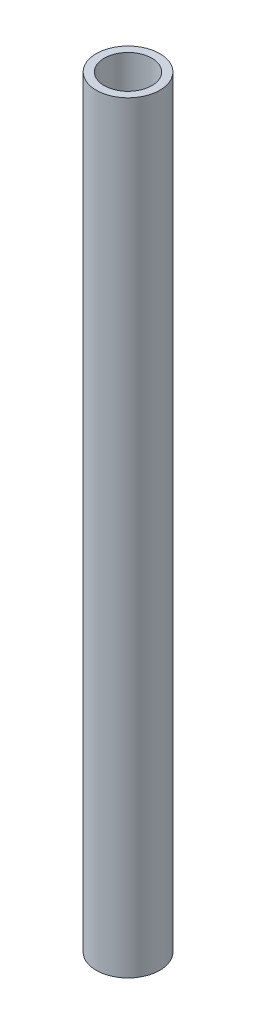
ISO-10303-21;
HEADER;
FILE_DESCRIPTION(('STEP AP214'),'2;1');
FILE_NAME('part.step','',(''),(''),'','','');
FILE_SCHEMA(('AUTOMOTIVE_DESIGN { 1 0 10303 214 1 1 1 1 }'));
ENDSEC;
DATA;
#1=APPLICATION_CONTEXT('core data for automotive mechanical design processes');
#2=APPLICATION_PROTOCOL_DEFINITION('international standard','automotive_design',2000,#1);
#3=PRODUCT_CONTEXT('',#1,'mechanical');
#4=PRODUCT('Part','Part','',(#3));
#5=PRODUCT_RELATED_PRODUCT_CATEGORY('part','',(#4));
#6=PRODUCT_DEFINITION_FORMATION('','',#4);
#7=PRODUCT_DEFINITION_CONTEXT('part definition',#1,'design');
#8=PRODUCT_DEFINITION('design','',#6,#7);
#9=PRODUCT_DEFINITION_SHAPE('','',#8);
#10=(LENGTH_UNIT() NAMED_UNIT(*) SI_UNIT(.MILLI.,.METRE.));
#11=(NAMED_UNIT(*) PLANE_ANGLE_UNIT() SI_UNIT($,.RADIAN.));
#12=(NAMED_UNIT(*) SI_UNIT($,.STERADIAN.) SOLID_ANGLE_UNIT());
#13=UNCERTAINTY_MEASURE_WITH_UNIT(LENGTH_MEASURE(1.E-05),#10,'distance_accuracy_value','');
#14=(GEOMETRIC_REPRESENTATION_CONTEXT(3) GLOBAL_UNCERTAINTY_ASSIGNED_CONTEXT((#13)) GLOBAL_UNIT_ASSIGNED_CONTEXT((#10,
#11,#12)) REPRESENTATION_CONTEXT('',''));
#15=CARTESIAN_POINT('',(0.,0.,0.));
#16=DIRECTION('',(0.,0.,1.));
#17=DIRECTION('',(1.,0.,0.));
#18=AXIS2_PLACEMENT_3D('',#15,#16,#17);
#19=CARTESIAN_POINT('',(0.,609.6,0.));
#20=DIRECTION('',(0.,1.,0.));
#21=DIRECTION('',(0.,0.,1.));
#22=AXIS2_PLACEMENT_3D('',#19,#20,#21);
#23=PLANE('',#22);
#24=CARTESIAN_POINT('',(0.,609.6,0.));
#25=DIRECTION('',(0.,1.,0.));
#26=DIRECTION('',(0.,0.,1.));
#27=AXIS2_PLACEMENT_3D('',#24,#25,#26);
#28=CIRCLE('',#27,25.4);
#29=CARTESIAN_POINT('',(0.,609.6,-25.4));
#30=VERTEX_POINT('',#29);
#31=EDGE_CURVE('E10',#30,#30,#28,.T.);
#32=ORIENTED_EDGE('',*,*,#31,.T.);
#33=EDGE_LOOP('',(#32));
#34=FACE_BOUND('',#33,.T.);
#35=CARTESIAN_POINT('',(0.,609.6,0.));
#36=DIRECTION('',(0.,1.,0.));
#37=DIRECTION('',(0.,0.,1.));
#38=AXIS2_PLACEMENT_3D('',#35,#36,#37);
#39=CIRCLE('',#38,19.05);
#40=CARTESIAN_POINT('',(0.,609.6,-19.05));
#41=VERTEX_POINT('',#40);
#42=EDGE_CURVE('E50',#41,#41,#39,.T.);
#43=ORIENTED_EDGE('',*,*,#42,.F.);
#44=EDGE_LOOP('',(#43));
#45=FACE_BOUND('',#44,.T.);
#46=ADVANCED_FACE('F37',(#34,#45),#23,.T.);
#47=CARTESIAN_POINT('',(0.,0.,0.));
#48=DIRECTION('',(0.,1.,0.));
#49=DIRECTION('',(0.,0.,1.));
#50=AXIS2_PLACEMENT_3D('',#47,#48,#49);
#51=PLANE('',#50);
#52=CARTESIAN_POINT('',(0.,0.,0.));
#53=DIRECTION('',(0.,1.,0.));
#54=DIRECTION('',(0.,0.,1.));
#55=AXIS2_PLACEMENT_3D('',#52,#53,#54);
#56=CIRCLE('',#55,25.4);
#57=CARTESIAN_POINT('',(0.,0.,-25.4));
#58=VERTEX_POINT('',#57);
#59=EDGE_CURVE('E41',#58,#58,#56,.T.);
#60=ORIENTED_EDGE('',*,*,#59,.F.);
#61=EDGE_LOOP('',(#60));
#62=FACE_BOUND('',#61,.T.);
#63=CARTESIAN_POINT('',(0.,0.,0.));
#64=DIRECTION('',(0.,1.,0.));
#65=DIRECTION('',(0.,0.,1.));
#66=AXIS2_PLACEMENT_3D('',#63,#64,#65);
#67=CIRCLE('',#66,19.05);
#68=CARTESIAN_POINT('',(0.,0.,-19.05));
#69=VERTEX_POINT('',#68);
#70=EDGE_CURVE('E52',#69,#69,#67,.T.);
#71=ORIENTED_EDGE('',*,*,#70,.T.);
#72=EDGE_LOOP('',(#71));
#73=FACE_BOUND('',#72,.T.);
#74=ADVANCED_FACE('F64',(#62,#73),#51,.F.);
#75=CARTESIAN_POINT('',(0.,609.6,0.));
#76=DIRECTION('',(0.,-1.,0.));
#77=DIRECTION('',(0.,0.,-1.));
#78=AXIS2_PLACEMENT_3D('',#75,#76,#77);
#79=CYLINDRICAL_SURFACE('',#78,25.4);
#80=CARTESIAN_POINT('',(0.,609.6,-25.4));
#81=CARTESIAN_POINT('',(0.,603.25,-25.4));
#82=CARTESIAN_POINT('',(0.,596.9,-25.4));
#83=CARTESIAN_POINT('',(0.,584.2,-25.4));
#84=CARTESIAN_POINT('',(0.,577.85,-25.4));
#85=CARTESIAN_POINT('',(0.,565.15,-25.4));
#86=CARTESIAN_POINT('',(0.,558.8,-25.4));
#87=CARTESIAN_POINT('',(0.,546.1,-25.4));
#88=CARTESIAN_POINT('',(0.,539.75,-25.4));
#89=CARTESIAN_POINT('',(0.,527.05,-25.4));
#90=CARTESIAN_POINT('',(0.,520.7,-25.4));
#91=CARTESIAN_POINT('',(0.,508.,-25.4));
#92=CARTESIAN_POINT('',(0.,501.65,-25.4));
#93=CARTESIAN_POINT('',(0.,488.95,-25.4));
#94=CARTESIAN_POINT('',(0.,482.6,-25.4));
#95=CARTESIAN_POINT('',(0.,469.9,-25.4));
#96=CARTESIAN_POINT('',(0.,463.55,-25.4));
#97=CARTESIAN_POINT('',(0.,450.85,-25.4));
#98=CARTESIAN_POINT('',(0.,444.5,-25.4));
#99=CARTESIAN_POINT('',(0.,431.8,-25.4));
#100=CARTESIAN_POINT('',(0.,425.45,-25.4));
#101=CARTESIAN_POINT('',(0.,412.75,-25.4));
#102=CARTESIAN_POINT('',(0.,406.4,-25.4));
#103=CARTESIAN_POINT('',(0.,393.7,-25.4));
#104=CARTESIAN_POINT('',(0.,387.35,-25.4));
#105=CARTESIAN_POINT('',(0.,374.65,-25.4));
#106=CARTESIAN_POINT('',(0.,368.3,-25.4));
#107=CARTESIAN_POINT('',(0.,355.6,-25.4));
#108=CARTESIAN_POINT('',(0.,349.25,-25.4));
#109=CARTESIAN_POINT('',(0.,336.55,-25.4));
#110=CARTESIAN_POINT('',(0.,330.2,-25.4));
#111=CARTESIAN_POINT('',(0.,317.5,-25.4));
#112=CARTESIAN_POINT('',(0.,311.15,-25.4));
#113=CARTESIAN_POINT('',(0.,298.45,-25.4));
#114=CARTESIAN_POINT('',(0.,292.1,-25.4));
#115=CARTESIAN_POINT('',(0.,279.4,-25.4));
#116=CARTESIAN_POINT('',(0.,273.05,-25.4));
#117=CARTESIAN_POINT('',(0.,260.35,-25.4));
#118=CARTESIAN_POINT('',(0.,254.,-25.4));
#119=CARTESIAN_POINT('',(0.,241.3,-25.4));
#120=CARTESIAN_POINT('',(0.,234.95,-25.4));
#121=CARTESIAN_POINT('',(0.,222.25,-25.4));
#122=CARTESIAN_POINT('',(0.,215.9,-25.4));
#123=CARTESIAN_POINT('',(0.,203.2,-25.4));
#124=CARTESIAN_POINT('',(0.,196.85,-25.4));
#125=CARTESIAN_POINT('',(0.,184.15,-25.4));
#126=CARTESIAN_POINT('',(0.,177.8,-25.4));
#127=CARTESIAN_POINT('',(0.,165.1,-25.4));
#128=CARTESIAN_POINT('',(0.,158.75,-25.4));
#129=CARTESIAN_POINT('',(0.,146.05,-25.4));
#130=CARTESIAN_POINT('',(0.,139.7,-25.4));
#131=CARTESIAN_POINT('',(0.,127.,-25.4));
#132=CARTESIAN_POINT('',(0.,120.65,-25.4));
#133=CARTESIAN_POINT('',(0.,107.95,-25.4));
#134=CARTESIAN_POINT('',(0.,101.6,-25.4));
#135=CARTESIAN_POINT('',(0.,88.9,-25.4));
#136=CARTESIAN_POINT('',(0.,82.5500000000001,-25.4));
#137=CARTESIAN_POINT('',(0.,69.85,-25.4));
#138=CARTESIAN_POINT('',(0.,63.5,-25.4));
#139=CARTESIAN_POINT('',(0.,50.8,-25.4));
#140=CARTESIAN_POINT('',(0.,44.45,-25.4));
#141=CARTESIAN_POINT('',(0.,31.75,-25.4));
#142=CARTESIAN_POINT('',(0.,25.4,-25.4));
#143=CARTESIAN_POINT('',(0.,12.7,-25.4));
#144=CARTESIAN_POINT('',(0.,6.35000000000001,-25.4));
#145=CARTESIAN_POINT('',(0.,0.,-25.4));
#146=B_SPLINE_CURVE_WITH_KNOTS('',3,(#80,#81,#82,#83,#84,#85,#86,#87,#88,#89,#90,#91,#92,#93,
#94,#95,#96,#97,#98,#99,#100,#101,#102,#103,#104,#105,#106,#107,#108,#109,#110,#111,#112,#113,
#114,#115,#116,#117,#118,#119,#120,#121,#122,#123,#124,#125,#126,#127,#128,#129,#130,#131,#132,
#133,#134,#135,#136,#137,#138,#139,#140,#141,#142,#143,#144,#145),.UNSPECIFIED.,.F.,.F.,(4,2,2,
2,2,2,2,2,2,2,2,2,2,2,2,2,2,2,2,2,2,2,2,2,2,2,2,2,2,2,2,2,4),(0.,19.05,38.1,57.15,76.2,
95.2500000000001,114.3,133.35,152.4,171.45,190.5,209.55,228.6,247.65,266.7,285.75,304.8,323.85,
342.9,361.95,381.,400.05,419.1,438.15,457.2,476.25,495.3,514.35,533.4,552.45,571.5,590.55,
609.6),.UNSPECIFIED.);
#147=EDGE_CURVE('BSEAM39',#30,#58,#146,.T.);
#148=ORIENTED_EDGE('',*,*,#31,.F.);
#149=ORIENTED_EDGE('',*,*,#59,.T.);
#150=ORIENTED_EDGE('',*,*,#147,.T.);
#151=ORIENTED_EDGE('',*,*,#147,.F.);
#152=EDGE_LOOP('',(#148,#150,#149,#151));
#153=FACE_BOUND('',#152,.T.);
#154=ADVANCED_FACE('F39',(#153),#79,.T.);
#155=CARTESIAN_POINT('',(0.,609.6,0.));
#156=DIRECTION('',(0.,-1.,0.));
#157=DIRECTION('',(0.,0.,-1.));
#158=AXIS2_PLACEMENT_3D('',#155,#156,#157);
#159=CYLINDRICAL_SURFACE('',#158,19.05);
#160=CARTESIAN_POINT('',(0.,609.6,-19.05));
#161=CARTESIAN_POINT('',(0.,603.25,-19.05));
#162=CARTESIAN_POINT('',(0.,596.9,-19.05));
#163=CARTESIAN_POINT('',(0.,584.2,-19.05));
#164=CARTESIAN_POINT('',(0.,577.85,-19.05));
#165=CARTESIAN_POINT('',(0.,565.15,-19.05));
#166=CARTESIAN_POINT('',(0.,558.8,-19.05));
#167=CARTESIAN_POINT('',(0.,546.1,-19.05));
#168=CARTESIAN_POINT('',(0.,539.75,-19.05));
#169=CARTESIAN_POINT('',(0.,527.05,-19.05));
#170=CARTESIAN_POINT('',(0.,520.7,-19.05));
#171=CARTESIAN_POINT('',(0.,508.,-19.05));
#172=CARTESIAN_POINT('',(0.,501.65,-19.05));
#173=CARTESIAN_POINT('',(0.,488.95,-19.05));
#174=CARTESIAN_POINT('',(0.,482.6,-19.05));
#175=CARTESIAN_POINT('',(0.,469.9,-19.05));
#176=CARTESIAN_POINT('',(0.,463.55,-19.05));
#177=CARTESIAN_POINT('',(0.,450.85,-19.05));
#178=CARTESIAN_POINT('',(0.,444.5,-19.05));
#179=CARTESIAN_POINT('',(0.,431.8,-19.05));
#180=CARTESIAN_POINT('',(0.,425.45,-19.05));
#181=CARTESIAN_POINT('',(0.,412.75,-19.05));
#182=CARTESIAN_POINT('',(0.,406.4,-19.05));
#183=CARTESIAN_POINT('',(0.,393.7,-19.05));
#184=CARTESIAN_POINT('',(0.,387.35,-19.05));
#185=CARTESIAN_POINT('',(0.,374.65,-19.05));
#186=CARTESIAN_POINT('',(0.,368.3,-19.05));
#187=CARTESIAN_POINT('',(0.,355.6,-19.05));
#188=CARTESIAN_POINT('',(0.,349.25,-19.05));
#189=CARTESIAN_POINT('',(0.,336.55,-19.05));
#190=CARTESIAN_POINT('',(0.,330.2,-19.05));
#191=CARTESIAN_POINT('',(0.,317.5,-19.05));
#192=CARTESIAN_POINT('',(0.,311.15,-19.05));
#193=CARTESIAN_POINT('',(0.,298.45,-19.05));
#194=CARTESIAN_POINT('',(0.,292.1,-19.05));
#195=CARTESIAN_POINT('',(0.,279.4,-19.05));
#196=CARTESIAN_POINT('',(0.,273.05,-19.05));
#197=CARTESIAN_POINT('',(0.,260.35,-19.05));
#198=CARTESIAN_POINT('',(0.,254.,-19.05));
#199=CARTESIAN_POINT('',(0.,241.3,-19.05));
#200=CARTESIAN_POINT('',(0.,234.95,-19.05));
#201=CARTESIAN_POINT('',(0.,222.25,-19.05));
#202=CARTESIAN_POINT('',(0.,215.9,-19.05));
#203=CARTESIAN_POINT('',(0.,203.2,-19.05));
#204=CARTESIAN_POINT('',(0.,196.85,-19.05));
#205=CARTESIAN_POINT('',(0.,184.15,-19.05));
#206=CARTESIAN_POINT('',(0.,177.8,-19.05));
#207=CARTESIAN_POINT('',(0.,165.1,-19.05));
#208=CARTESIAN_POINT('',(0.,158.75,-19.05));
#209=CARTESIAN_POINT('',(0.,146.05,-19.05));
#210=CARTESIAN_POINT('',(0.,139.7,-19.05));
#211=CARTESIAN_POINT('',(0.,127.,-19.05));
#212=CARTESIAN_POINT('',(0.,120.65,-19.05));
#213=CARTESIAN_POINT('',(0.,107.95,-19.05));
#214=CARTESIAN_POINT('',(0.,101.6,-19.05));
#215=CARTESIAN_POINT('',(0.,88.9,-19.05));
#216=CARTESIAN_POINT('',(0.,82.5500000000001,-19.05));
#217=CARTESIAN_POINT('',(0.,69.85,-19.05));
#218=CARTESIAN_POINT('',(0.,63.5,-19.05));
#219=CARTESIAN_POINT('',(0.,50.8,-19.05));
#220=CARTESIAN_POINT('',(0.,44.45,-19.05));
#221=CARTESIAN_POINT('',(0.,31.75,-19.05));
#222=CARTESIAN_POINT('',(0.,25.4,-19.05));
#223=CARTESIAN_POINT('',(0.,12.7,-19.05));
#224=CARTESIAN_POINT('',(0.,6.35000000000001,-19.05));
#225=CARTESIAN_POINT('',(0.,0.,-19.05));
#226=B_SPLINE_CURVE_WITH_KNOTS('',3,(#160,#161,#162,#163,#164,#165,#166,#167,#168,#169,#170,
#171,#172,#173,#174,#175,#176,#177,#178,#179,#180,#181,#182,#183,#184,#185,#186,#187,#188,#189,
#190,#191,#192,#193,#194,#195,#196,#197,#198,#199,#200,#201,#202,#203,#204,#205,#206,#207,#208,
#209,#210,#211,#212,#213,#214,#215,#216,#217,#218,#219,#220,#221,#222,#223,#224,#225),
.UNSPECIFIED.,.F.,.F.,(4,2,2,2,2,2,2,2,2,2,2,2,2,2,2,2,2,2,2,2,2,2,2,2,2,2,2,2,2,2,2,2,4),(0.,
19.0499999999999,38.0999999999999,57.1499999999999,76.1999999999999,95.2499999999999,114.3,
133.35,152.4,171.45,190.5,209.55,228.6,247.65,266.7,285.75,304.8,323.85,342.9,361.95,381.,
400.05,419.1,438.15,457.2,476.25,495.3,514.35,533.4,552.45,571.5,590.55,609.6),.UNSPECIFIED.);
#227=EDGE_CURVE('BSEAM60',#41,#69,#226,.T.);
#228=ORIENTED_EDGE('',*,*,#42,.T.);
#229=ORIENTED_EDGE('',*,*,#70,.F.);
#230=ORIENTED_EDGE('',*,*,#227,.T.);
#231=ORIENTED_EDGE('',*,*,#227,.F.);
#232=EDGE_LOOP('',(#228,#230,#229,#231));
#233=FACE_BOUND('',#232,.T.);
#234=ADVANCED_FACE('F60',(#233),#159,.F.);
#235=CLOSED_SHELL('',(#46,#74,#154,#234));
#236=MANIFOLD_SOLID_BREP('B2',#235);
#237=ADVANCED_BREP_SHAPE_REPRESENTATION('',(#18,#236),#14);
#238=SHAPE_DEFINITION_REPRESENTATION(#9,#237);
ENDSEC;
END-ISO-10303-21;
